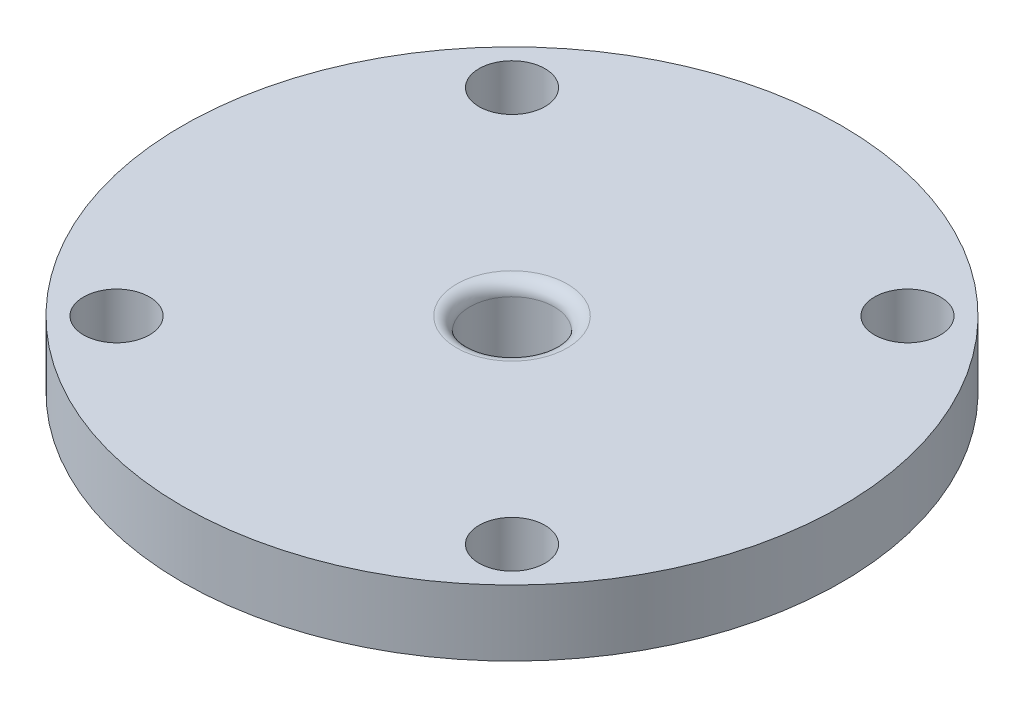
ISO-10303-21;
HEADER;
FILE_DESCRIPTION(('STEP AP214'),'2;1');
FILE_NAME('part.step','',(''),(''),'','','');
FILE_SCHEMA(('AUTOMOTIVE_DESIGN { 1 0 10303 214 1 1 1 1 }'));
ENDSEC;
DATA;
#1=APPLICATION_CONTEXT('core data for automotive mechanical design processes');
#2=APPLICATION_PROTOCOL_DEFINITION('international standard','automotive_design',2000,#1);
#3=PRODUCT_CONTEXT('',#1,'mechanical');
#4=PRODUCT('Part','Part','',(#3));
#5=PRODUCT_RELATED_PRODUCT_CATEGORY('part','',(#4));
#6=PRODUCT_DEFINITION_FORMATION('','',#4);
#7=PRODUCT_DEFINITION_CONTEXT('part definition',#1,'design');
#8=PRODUCT_DEFINITION('design','',#6,#7);
#9=PRODUCT_DEFINITION_SHAPE('','',#8);
#10=(LENGTH_UNIT() NAMED_UNIT(*) SI_UNIT(.MILLI.,.METRE.));
#11=(NAMED_UNIT(*) PLANE_ANGLE_UNIT() SI_UNIT($,.RADIAN.));
#12=(NAMED_UNIT(*) SI_UNIT($,.STERADIAN.) SOLID_ANGLE_UNIT());
#13=UNCERTAINTY_MEASURE_WITH_UNIT(LENGTH_MEASURE(1.E-05),#10,'distance_accuracy_value','');
#14=(GEOMETRIC_REPRESENTATION_CONTEXT(3) GLOBAL_UNCERTAINTY_ASSIGNED_CONTEXT((#13)) GLOBAL_UNIT_ASSIGNED_CONTEXT((#10,
#11,#12)) REPRESENTATION_CONTEXT('',''));
#15=CARTESIAN_POINT('',(0.,0.,0.));
#16=DIRECTION('',(0.,0.,1.));
#17=DIRECTION('',(1.,0.,0.));
#18=AXIS2_PLACEMENT_3D('',#15,#16,#17);
#19=CARTESIAN_POINT('',(0.,5.,0.));
#20=DIRECTION('',(0.,-1.,0.));
#21=DIRECTION('',(0.,0.,-1.));
#22=AXIS2_PLACEMENT_3D('',#19,#20,#21);
#23=CYLINDRICAL_SURFACE('',#22,25.);
#24=CARTESIAN_POINT('',(0.,5.,0.));
#25=DIRECTION('',(0.,1.,0.));
#26=DIRECTION('',(0.,0.,1.));
#27=AXIS2_PLACEMENT_3D('',#24,#25,#26);
#28=CIRCLE('',#27,25.);
#29=CARTESIAN_POINT('',(0.,5.,25.));
#30=VERTEX_POINT('',#29);
#31=EDGE_CURVE('E54',#30,#30,#28,.T.);
#32=ORIENTED_EDGE('',*,*,#31,.F.);
#33=EDGE_LOOP('',(#32));
#34=FACE_BOUND('',#33,.T.);
#35=CARTESIAN_POINT('',(0.,0.,0.));
#36=DIRECTION('',(0.,1.,0.));
#37=DIRECTION('',(0.,0.,1.));
#38=AXIS2_PLACEMENT_3D('',#35,#36,#37);
#39=CIRCLE('',#38,25.);
#40=CARTESIAN_POINT('',(0.,0.,25.));
#41=VERTEX_POINT('',#40);
#42=EDGE_CURVE('E59',#41,#41,#39,.T.);
#43=ORIENTED_EDGE('',*,*,#42,.T.);
#44=EDGE_LOOP('',(#43));
#45=FACE_BOUND('',#44,.T.);
#46=ADVANCED_FACE('F41',(#34,#45),#23,.T.);
#47=CARTESIAN_POINT('',(0.,5.,0.));
#48=DIRECTION('',(0.,1.,0.));
#49=DIRECTION('',(0.,0.,1.));
#50=AXIS2_PLACEMENT_3D('',#47,#48,#49);
#51=PLANE('',#50);
#52=CARTESIAN_POINT('',(0.,5.,0.));
#53=DIRECTION('',(0.,1.,0.));
#54=DIRECTION('',(0.,0.,1.));
#55=AXIS2_PLACEMENT_3D('',#52,#53,#54);
#56=CIRCLE('',#55,4.2);
#57=CARTESIAN_POINT('',(0.,5.,4.2));
#58=VERTEX_POINT('',#57);
#59=EDGE_CURVE('E10',#58,#58,#56,.F.);
#60=ORIENTED_EDGE('',*,*,#59,.T.);
#61=EDGE_LOOP('',(#60));
#62=FACE_BOUND('',#61,.T.);
#63=CARTESIAN_POINT('',(-15.,5.,15.));
#64=DIRECTION('',(0.,1.,0.));
#65=DIRECTION('',(0.,0.,1.));
#66=AXIS2_PLACEMENT_3D('',#63,#64,#65);
#67=CIRCLE('',#66,2.50000000000006);
#68=CARTESIAN_POINT('',(-15.,5.,17.5000000000001));
#69=VERTEX_POINT('',#68);
#70=EDGE_CURVE('E78',#69,#69,#67,.T.);
#71=ORIENTED_EDGE('',*,*,#70,.F.);
#72=EDGE_LOOP('',(#71));
#73=FACE_BOUND('',#72,.T.);
#74=CARTESIAN_POINT('',(15.,5.,15.));
#75=DIRECTION('',(0.,1.,0.));
#76=DIRECTION('',(0.,0.,1.));
#77=AXIS2_PLACEMENT_3D('',#74,#75,#76);
#78=CIRCLE('',#77,2.5);
#79=CARTESIAN_POINT('',(15.,5.,17.5));
#80=VERTEX_POINT('',#79);
#81=EDGE_CURVE('E87',#80,#80,#78,.T.);
#82=ORIENTED_EDGE('',*,*,#81,.F.);
#83=EDGE_LOOP('',(#82));
#84=FACE_BOUND('',#83,.T.);
#85=CARTESIAN_POINT('',(15.,5.,-15.));
#86=DIRECTION('',(0.,1.,0.));
#87=DIRECTION('',(0.,0.,1.));
#88=AXIS2_PLACEMENT_3D('',#85,#86,#87);
#89=CIRCLE('',#88,2.5);
#90=CARTESIAN_POINT('',(15.,5.,-12.5));
#91=VERTEX_POINT('',#90);
#92=EDGE_CURVE('E70',#91,#91,#89,.T.);
#93=ORIENTED_EDGE('',*,*,#92,.F.);
#94=EDGE_LOOP('',(#93));
#95=FACE_BOUND('',#94,.T.);
#96=CARTESIAN_POINT('',(-15.,5.,-15.));
#97=DIRECTION('',(0.,1.,0.));
#98=DIRECTION('',(0.,0.,1.));
#99=AXIS2_PLACEMENT_3D('',#96,#97,#98);
#100=CIRCLE('',#99,2.5);
#101=CARTESIAN_POINT('',(-15.,5.,-12.5));
#102=VERTEX_POINT('',#101);
#103=EDGE_CURVE('E66',#102,#102,#100,.T.);
#104=ORIENTED_EDGE('',*,*,#103,.F.);
#105=EDGE_LOOP('',(#104));
#106=FACE_BOUND('',#105,.T.);
#107=ORIENTED_EDGE('',*,*,#31,.T.);
#108=EDGE_LOOP('',(#107));
#109=FACE_BOUND('',#108,.T.);
#110=ADVANCED_FACE('F119',(#62,#73,#84,#95,#106,#109),#51,.T.);
#111=CARTESIAN_POINT('',(0.,0.,0.));
#112=DIRECTION('',(0.,1.,0.));
#113=DIRECTION('',(0.,0.,1.));
#114=AXIS2_PLACEMENT_3D('',#111,#112,#113);
#115=PLANE('',#114);
#116=CARTESIAN_POINT('',(0.,0.,0.));
#117=DIRECTION('',(0.,1.,0.));
#118=DIRECTION('',(0.,0.,1.));
#119=AXIS2_PLACEMENT_3D('',#116,#117,#118);
#120=CIRCLE('',#119,3.2);
#121=CARTESIAN_POINT('',(0.,0.,3.2));
#122=VERTEX_POINT('',#121);
#123=EDGE_CURVE('E79',#122,#122,#120,.T.);
#124=ORIENTED_EDGE('',*,*,#123,.T.);
#125=EDGE_LOOP('',(#124));
#126=FACE_BOUND('',#125,.T.);
#127=CARTESIAN_POINT('',(-15.,0.,15.));
#128=DIRECTION('',(0.,1.,0.));
#129=DIRECTION('',(0.,0.,1.));
#130=AXIS2_PLACEMENT_3D('',#127,#128,#129);
#131=CIRCLE('',#130,2.50000000000006);
#132=CARTESIAN_POINT('',(-15.,0.,17.5000000000001));
#133=VERTEX_POINT('',#132);
#134=EDGE_CURVE('E74',#133,#133,#131,.T.);
#135=ORIENTED_EDGE('',*,*,#134,.T.);
#136=EDGE_LOOP('',(#135));
#137=FACE_BOUND('',#136,.T.);
#138=CARTESIAN_POINT('',(15.,0.,15.));
#139=DIRECTION('',(0.,1.,0.));
#140=DIRECTION('',(0.,0.,1.));
#141=AXIS2_PLACEMENT_3D('',#138,#139,#140);
#142=CIRCLE('',#141,2.5);
#143=CARTESIAN_POINT('',(15.,0.,17.5));
#144=VERTEX_POINT('',#143);
#145=EDGE_CURVE('E83',#144,#144,#142,.T.);
#146=ORIENTED_EDGE('',*,*,#145,.T.);
#147=EDGE_LOOP('',(#146));
#148=FACE_BOUND('',#147,.T.);
#149=CARTESIAN_POINT('',(15.,0.,-15.));
#150=DIRECTION('',(0.,1.,0.));
#151=DIRECTION('',(0.,0.,1.));
#152=AXIS2_PLACEMENT_3D('',#149,#150,#151);
#153=CIRCLE('',#152,2.5);
#154=CARTESIAN_POINT('',(15.,0.,-12.5));
#155=VERTEX_POINT('',#154);
#156=EDGE_CURVE('E91',#155,#155,#153,.T.);
#157=ORIENTED_EDGE('',*,*,#156,.T.);
#158=EDGE_LOOP('',(#157));
#159=FACE_BOUND('',#158,.T.);
#160=CARTESIAN_POINT('',(-15.,0.,-15.));
#161=DIRECTION('',(0.,1.,0.));
#162=DIRECTION('',(0.,0.,1.));
#163=AXIS2_PLACEMENT_3D('',#160,#161,#162);
#164=CIRCLE('',#163,2.5);
#165=CARTESIAN_POINT('',(-15.,0.,-12.5));
#166=VERTEX_POINT('',#165);
#167=EDGE_CURVE('E64',#166,#166,#164,.T.);
#168=ORIENTED_EDGE('',*,*,#167,.T.);
#169=EDGE_LOOP('',(#168));
#170=FACE_BOUND('',#169,.T.);
#171=ORIENTED_EDGE('',*,*,#42,.F.);
#172=EDGE_LOOP('',(#171));
#173=FACE_BOUND('',#172,.T.);
#174=ADVANCED_FACE('F102',(#126,#137,#148,#159,#170,#173),#115,.F.);
#175=CARTESIAN_POINT('',(-15.,0.,-15.));
#176=DIRECTION('',(0.,1.,0.));
#177=DIRECTION('',(0.,0.,1.));
#178=AXIS2_PLACEMENT_3D('',#175,#176,#177);
#179=CYLINDRICAL_SURFACE('',#178,2.5);
#180=ORIENTED_EDGE('',*,*,#167,.F.);
#181=EDGE_LOOP('',(#180));
#182=FACE_BOUND('',#181,.T.);
#183=ORIENTED_EDGE('',*,*,#103,.T.);
#184=EDGE_LOOP('',(#183));
#185=FACE_BOUND('',#184,.T.);
#186=ADVANCED_FACE('F129',(#182,#185),#179,.F.);
#187=CARTESIAN_POINT('',(15.,0.,-15.));
#188=DIRECTION('',(0.,1.,0.));
#189=DIRECTION('',(0.,0.,1.));
#190=AXIS2_PLACEMENT_3D('',#187,#188,#189);
#191=CYLINDRICAL_SURFACE('',#190,2.5);
#192=ORIENTED_EDGE('',*,*,#156,.F.);
#193=EDGE_LOOP('',(#192));
#194=FACE_BOUND('',#193,.T.);
#195=ORIENTED_EDGE('',*,*,#92,.T.);
#196=EDGE_LOOP('',(#195));
#197=FACE_BOUND('',#196,.T.);
#198=ADVANCED_FACE('F132',(#194,#197),#191,.F.);
#199=CARTESIAN_POINT('',(15.,0.,15.));
#200=DIRECTION('',(0.,1.,0.));
#201=DIRECTION('',(0.,0.,1.));
#202=AXIS2_PLACEMENT_3D('',#199,#200,#201);
#203=CYLINDRICAL_SURFACE('',#202,2.5);
#204=ORIENTED_EDGE('',*,*,#145,.F.);
#205=EDGE_LOOP('',(#204));
#206=FACE_BOUND('',#205,.T.);
#207=ORIENTED_EDGE('',*,*,#81,.T.);
#208=EDGE_LOOP('',(#207));
#209=FACE_BOUND('',#208,.T.);
#210=ADVANCED_FACE('F114',(#206,#209),#203,.F.);
#211=CARTESIAN_POINT('',(-15.,0.,15.));
#212=DIRECTION('',(0.,1.,0.));
#213=DIRECTION('',(0.,0.,1.));
#214=AXIS2_PLACEMENT_3D('',#211,#212,#213);
#215=CYLINDRICAL_SURFACE('',#214,2.50000000000006);
#216=ORIENTED_EDGE('',*,*,#134,.F.);
#217=EDGE_LOOP('',(#216));
#218=FACE_BOUND('',#217,.T.);
#219=ORIENTED_EDGE('',*,*,#70,.T.);
#220=EDGE_LOOP('',(#219));
#221=FACE_BOUND('',#220,.T.);
#222=ADVANCED_FACE('F107',(#218,#221),#215,.F.);
#223=CARTESIAN_POINT('',(0.,0.,0.));
#224=DIRECTION('',(0.,1.,0.));
#225=DIRECTION('',(0.,0.,1.));
#226=AXIS2_PLACEMENT_3D('',#223,#224,#225);
#227=CYLINDRICAL_SURFACE('',#226,3.2);
#228=CARTESIAN_POINT('',(0.,4.,0.));
#229=DIRECTION('',(0.,1.,0.));
#230=DIRECTION('',(0.,0.,1.));
#231=AXIS2_PLACEMENT_3D('',#228,#229,#230);
#232=CIRCLE('',#231,3.2);
#233=CARTESIAN_POINT('',(0.,4.,3.2));
#234=VERTEX_POINT('',#233);
#235=EDGE_CURVE('E49',#234,#234,#232,.T.);
#236=ORIENTED_EDGE('',*,*,#235,.T.);
#237=EDGE_LOOP('',(#236));
#238=FACE_BOUND('',#237,.T.);
#239=ORIENTED_EDGE('',*,*,#123,.F.);
#240=EDGE_LOOP('',(#239));
#241=FACE_BOUND('',#240,.T.);
#242=ADVANCED_FACE('F105',(#238,#241),#227,.F.);
#243=CARTESIAN_POINT('',(0.,4.,0.));
#244=DIRECTION('',(0.,1.,0.));
#245=DIRECTION('',(0.,0.,1.));
#246=AXIS2_PLACEMENT_3D('',#243,#244,#245);
#247=TOROIDAL_SURFACE('',#246,4.2,1.);
#248=ORIENTED_EDGE('',*,*,#59,.F.);
#249=EDGE_LOOP('',(#248));
#250=FACE_BOUND('',#249,.T.);
#251=ORIENTED_EDGE('',*,*,#235,.F.);
#252=EDGE_LOOP('',(#251));
#253=FACE_BOUND('',#252,.T.);
#254=ADVANCED_FACE('F43',(#250,#253),#247,.T.);
#255=CLOSED_SHELL('',(#46,#110,#174,#186,#198,#210,#222,#242,#254));
#256=MANIFOLD_SOLID_BREP('B2',#255);
#257=ADVANCED_BREP_SHAPE_REPRESENTATION('',(#18,#256),#14);
#258=SHAPE_DEFINITION_REPRESENTATION(#9,#257);
ENDSEC;
END-ISO-10303-21;
